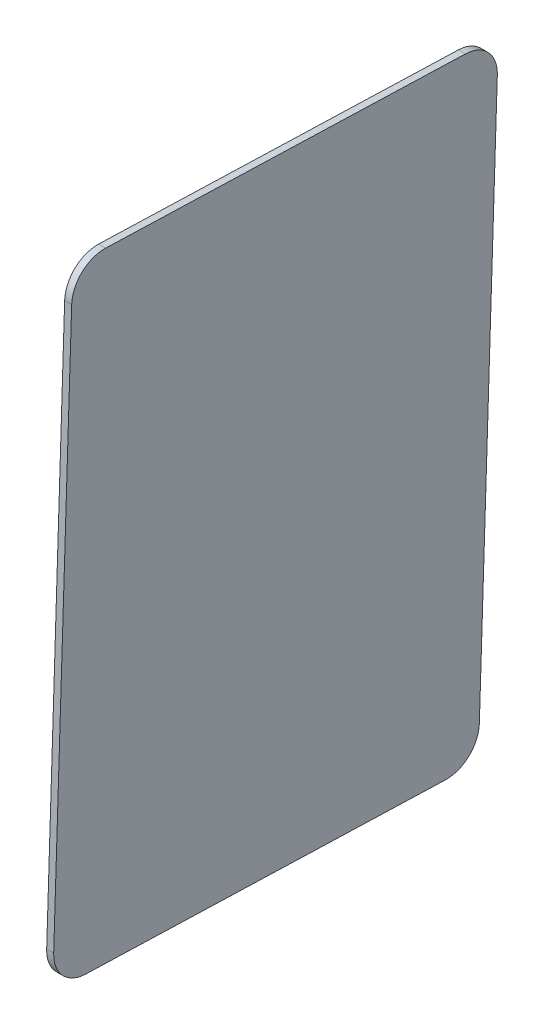
ISO-10303-21;
HEADER;
FILE_DESCRIPTION(('STEP AP214'),'2;1');
FILE_NAME('part.step','',(''),(''),'','','');
FILE_SCHEMA(('AUTOMOTIVE_DESIGN { 1 0 10303 214 1 1 1 1 }'));
ENDSEC;
DATA;
#1=APPLICATION_CONTEXT('core data for automotive mechanical design processes');
#2=APPLICATION_PROTOCOL_DEFINITION('international standard','automotive_design',2000,#1);
#3=PRODUCT_CONTEXT('',#1,'mechanical');
#4=PRODUCT('Part','Part','',(#3));
#5=PRODUCT_RELATED_PRODUCT_CATEGORY('part','',(#4));
#6=PRODUCT_DEFINITION_FORMATION('','',#4);
#7=PRODUCT_DEFINITION_CONTEXT('part definition',#1,'design');
#8=PRODUCT_DEFINITION('design','',#6,#7);
#9=PRODUCT_DEFINITION_SHAPE('','',#8);
#10=(LENGTH_UNIT() NAMED_UNIT(*) SI_UNIT(.MILLI.,.METRE.));
#11=(NAMED_UNIT(*) PLANE_ANGLE_UNIT() SI_UNIT($,.RADIAN.));
#12=(NAMED_UNIT(*) SI_UNIT($,.STERADIAN.) SOLID_ANGLE_UNIT());
#13=UNCERTAINTY_MEASURE_WITH_UNIT(LENGTH_MEASURE(1.E-05),#10,'distance_accuracy_value','');
#14=(GEOMETRIC_REPRESENTATION_CONTEXT(3) GLOBAL_UNCERTAINTY_ASSIGNED_CONTEXT((#13)) GLOBAL_UNIT_ASSIGNED_CONTEXT((#10,
#11,#12)) REPRESENTATION_CONTEXT('',''));
#15=CARTESIAN_POINT('',(0.,0.,0.));
#16=DIRECTION('',(0.,0.,1.));
#17=DIRECTION('',(1.,0.,0.));
#18=AXIS2_PLACEMENT_3D('',#15,#16,#17);
#19=CARTESIAN_POINT('',(-1.5875,93.6404901719661,16.3075723620404));
#20=DIRECTION('',(1.,0.,0.));
#21=DIRECTION('',(0.,0.,-1.));
#22=AXIS2_PLACEMENT_3D('',#19,#20,#21);
#23=CYLINDRICAL_SURFACE('',#22,7.45300000000001);
#24=CARTESIAN_POINT('',(0.,93.6404901719661,16.3075723620404));
#25=DIRECTION('',(1.,0.,0.));
#26=DIRECTION('',(0.,0.,-1.));
#27=AXIS2_PLACEMENT_3D('',#24,#25,#26);
#28=CIRCLE('',#27,7.45300000000001);
#29=CARTESIAN_POINT('',(0.,86.1914285600398,16.5498327626973));
#30=VERTEX_POINT('',#29);
#31=CARTESIAN_POINT('',(0.,93.3982297713091,8.85851075011408));
#32=VERTEX_POINT('',#31);
#33=EDGE_CURVE('E132',#30,#32,#28,.T.);
#34=ORIENTED_EDGE('',*,*,#33,.F.);
#35=DIRECTION('',(1.,0.,0.));
#36=VECTOR('',#35,1.);
#37=CARTESIAN_POINT('',(-1.5875,86.1914285600398,16.5498327626973));
#38=LINE('',#37,#36);
#39=CARTESIAN_POINT('',(-1.5875,86.1914285600398,16.5498327626973));
#40=VERTEX_POINT('',#39);
#41=EDGE_CURVE('E11',#40,#30,#38,.T.);
#42=ORIENTED_EDGE('',*,*,#41,.F.);
#43=CARTESIAN_POINT('',(-1.5875,93.6404901719661,16.3075723620404));
#44=DIRECTION('',(1.,0.,0.));
#45=DIRECTION('',(0.,0.,-1.));
#46=AXIS2_PLACEMENT_3D('',#43,#44,#45);
#47=CIRCLE('',#46,7.45300000000001);
#48=CARTESIAN_POINT('',(-1.5875,93.3982297713091,8.85851075011408));
#49=VERTEX_POINT('',#48);
#50=EDGE_CURVE('E152',#40,#49,#47,.T.);
#51=ORIENTED_EDGE('',*,*,#50,.T.);
#52=DIRECTION('',(1.,0.,0.));
#53=VECTOR('',#52,1.);
#54=CARTESIAN_POINT('',(-1.5875,93.3982297713091,8.85851075011408));
#55=LINE('',#54,#53);
#56=EDGE_CURVE('E38',#49,#32,#55,.T.);
#57=ORIENTED_EDGE('',*,*,#56,.T.);
#58=EDGE_LOOP('',(#34,#42,#51,#57));
#59=FACE_BOUND('',#58,.T.);
#60=ADVANCED_FACE('F35',(#59),#23,.T.);
#61=CARTESIAN_POINT('',(-1.5875,88.8375700381402,97.9138148695109));
#62=DIRECTION('',(0.,-0.999471570096104,0.0325050852887394));
#63=DIRECTION('',(0.,-0.0325050852887394,-0.999471570096104));
#64=AXIS2_PLACEMENT_3D('',#61,#62,#63);
#65=PLANE('',#64);
#66=DIRECTION('',(0.,-0.0325050852887394,-0.999471570096104));
#67=VECTOR('',#66,1.);
#68=CARTESIAN_POINT('',(0.,88.8375700381402,97.9138148695109));
#69=LINE('',#68,#67);
#70=CARTESIAN_POINT('',(0.,88.8375700381402,97.9138148695109));
#71=VERTEX_POINT('',#70);
#72=EDGE_CURVE('E150',#71,#30,#69,.T.);
#73=ORIENTED_EDGE('',*,*,#72,.F.);
#74=DIRECTION('',(1.,0.,0.));
#75=VECTOR('',#74,1.);
#76=CARTESIAN_POINT('',(-1.5875,88.8375700381402,97.9138148695109));
#77=LINE('',#76,#75);
#78=CARTESIAN_POINT('',(-1.5875,88.8375700381402,97.9138148695109));
#79=VERTEX_POINT('',#78);
#80=EDGE_CURVE('E44',#79,#71,#77,.T.);
#81=ORIENTED_EDGE('',*,*,#80,.F.);
#82=DIRECTION('',(0.,-0.0325050852887394,-0.999471570096104));
#83=VECTOR('',#82,1.);
#84=CARTESIAN_POINT('',(-1.5875,88.8375700381402,97.9138148695109));
#85=LINE('',#84,#83);
#86=EDGE_CURVE('E122',#79,#40,#85,.T.);
#87=ORIENTED_EDGE('',*,*,#86,.T.);
#88=ORIENTED_EDGE('',*,*,#41,.T.);
#89=EDGE_LOOP('',(#73,#81,#87,#88));
#90=FACE_BOUND('',#89,.T.);
#91=ADVANCED_FACE('F164',(#90),#65,.T.);
#92=CARTESIAN_POINT('',(-1.5875,96.2866316500665,97.6715544688539));
#93=DIRECTION('',(1.,0.,0.));
#94=DIRECTION('',(0.,0.,-1.));
#95=AXIS2_PLACEMENT_3D('',#92,#93,#94);
#96=CYLINDRICAL_SURFACE('',#95,7.453);
#97=CARTESIAN_POINT('',(0.,96.2866316500665,97.6715544688539));
#98=DIRECTION('',(1.,0.,0.));
#99=DIRECTION('',(0.,0.,-1.));
#100=AXIS2_PLACEMENT_3D('',#97,#98,#99);
#101=CIRCLE('',#100,7.453);
#102=CARTESIAN_POINT('',(0.,96.5288920507234,105.12061608078));
#103=VERTEX_POINT('',#102);
#104=EDGE_CURVE('E109',#103,#71,#101,.T.);
#105=ORIENTED_EDGE('',*,*,#104,.F.);
#106=DIRECTION('',(1.,0.,0.));
#107=VECTOR('',#106,1.);
#108=CARTESIAN_POINT('',(-1.5875,96.5288920507234,105.12061608078));
#109=LINE('',#108,#107);
#110=CARTESIAN_POINT('',(-1.5875,96.5288920507234,105.12061608078));
#111=VERTEX_POINT('',#110);
#112=EDGE_CURVE('E104',#111,#103,#109,.T.);
#113=ORIENTED_EDGE('',*,*,#112,.F.);
#114=CARTESIAN_POINT('',(-1.5875,96.2866316500665,97.6715544688539));
#115=DIRECTION('',(1.,0.,0.));
#116=DIRECTION('',(0.,0.,-1.));
#117=AXIS2_PLACEMENT_3D('',#114,#115,#116);
#118=CIRCLE('',#117,7.453);
#119=EDGE_CURVE('E107',#111,#79,#118,.T.);
#120=ORIENTED_EDGE('',*,*,#119,.T.);
#121=ORIENTED_EDGE('',*,*,#80,.T.);
#122=EDGE_LOOP('',(#105,#113,#120,#121));
#123=FACE_BOUND('',#122,.T.);
#124=ADVANCED_FACE('F106',(#123),#96,.T.);
#125=CARTESIAN_POINT('',(-1.5875,221.557788111896,101.054392436585));
#126=DIRECTION('',(0.,0.0325050852887394,0.999471570096104));
#127=DIRECTION('',(0.,-0.999471570096104,0.0325050852887394));
#128=AXIS2_PLACEMENT_3D('',#125,#126,#127);
#129=PLANE('',#128);
#130=DIRECTION('',(0.,-0.999471570096104,0.0325050852887394));
#131=VECTOR('',#130,1.);
#132=CARTESIAN_POINT('',(0.,221.557788111896,101.054392436585));
#133=LINE('',#132,#131);
#134=CARTESIAN_POINT('',(0.,221.557788111896,101.054392436585));
#135=VERTEX_POINT('',#134);
#136=EDGE_CURVE('E147',#135,#103,#133,.T.);
#137=ORIENTED_EDGE('',*,*,#136,.F.);
#138=DIRECTION('',(1.,0.,0.));
#139=VECTOR('',#138,1.);
#140=CARTESIAN_POINT('',(-1.5875,221.557788111896,101.054392436585));
#141=LINE('',#140,#139);
#142=CARTESIAN_POINT('',(-1.5875,221.557788111896,101.054392436585));
#143=VERTEX_POINT('',#142);
#144=EDGE_CURVE('E114',#143,#135,#141,.T.);
#145=ORIENTED_EDGE('',*,*,#144,.F.);
#146=DIRECTION('',(0.,-0.999471570096104,0.0325050852887394));
#147=VECTOR('',#146,1.);
#148=CARTESIAN_POINT('',(-1.5875,221.557788111896,101.054392436585));
#149=LINE('',#148,#147);
#150=EDGE_CURVE('E120',#143,#111,#149,.T.);
#151=ORIENTED_EDGE('',*,*,#150,.T.);
#152=ORIENTED_EDGE('',*,*,#112,.T.);
#153=EDGE_LOOP('',(#137,#145,#151,#152));
#154=FACE_BOUND('',#153,.T.);
#155=ADVANCED_FACE('F124',(#154),#129,.T.);
#156=CARTESIAN_POINT('',(-1.5875,221.315527711239,93.605330824659));
#157=DIRECTION('',(1.,0.,0.));
#158=DIRECTION('',(0.,0.,-1.));
#159=AXIS2_PLACEMENT_3D('',#156,#157,#158);
#160=CYLINDRICAL_SURFACE('',#159,7.453);
#161=CARTESIAN_POINT('',(0.,221.315527711239,93.605330824659));
#162=DIRECTION('',(1.,0.,0.));
#163=DIRECTION('',(0.,0.,-1.));
#164=AXIS2_PLACEMENT_3D('',#161,#162,#163);
#165=CIRCLE('',#164,7.453);
#166=CARTESIAN_POINT('',(0.,228.764589323165,93.3630704240021));
#167=VERTEX_POINT('',#166);
#168=EDGE_CURVE('E144',#167,#135,#165,.T.);
#169=ORIENTED_EDGE('',*,*,#168,.F.);
#170=DIRECTION('',(1.,0.,0.));
#171=VECTOR('',#170,1.);
#172=CARTESIAN_POINT('',(-1.5875,228.764589323165,93.3630704240021));
#173=LINE('',#172,#171);
#174=CARTESIAN_POINT('',(-1.5875,228.764589323165,93.3630704240021));
#175=VERTEX_POINT('',#174);
#176=EDGE_CURVE('E156',#175,#167,#173,.T.);
#177=ORIENTED_EDGE('',*,*,#176,.F.);
#178=CARTESIAN_POINT('',(-1.5875,221.315527711239,93.605330824659));
#179=DIRECTION('',(1.,0.,0.));
#180=DIRECTION('',(0.,0.,-1.));
#181=AXIS2_PLACEMENT_3D('',#178,#179,#180);
#182=CIRCLE('',#181,7.453);
#183=EDGE_CURVE('E125',#175,#143,#182,.T.);
#184=ORIENTED_EDGE('',*,*,#183,.T.);
#185=ORIENTED_EDGE('',*,*,#144,.T.);
#186=EDGE_LOOP('',(#169,#177,#184,#185));
#187=FACE_BOUND('',#186,.T.);
#188=ADVANCED_FACE('F177',(#187),#160,.T.);
#189=CARTESIAN_POINT('',(-1.5875,226.118447845064,11.9990883171885));
#190=DIRECTION('',(0.,0.999471570096104,-0.0325050852887394));
#191=DIRECTION('',(0.,0.0325050852887394,0.999471570096104));
#192=AXIS2_PLACEMENT_3D('',#189,#190,#191);
#193=PLANE('',#192);
#194=DIRECTION('',(0.,0.0325050852887394,0.999471570096104));
#195=VECTOR('',#194,1.);
#196=CARTESIAN_POINT('',(0.,226.118447845064,11.9990883171885));
#197=LINE('',#196,#195);
#198=CARTESIAN_POINT('',(0.,226.118447845064,11.9990883171885));
#199=VERTEX_POINT('',#198);
#200=EDGE_CURVE('E141',#199,#167,#197,.T.);
#201=ORIENTED_EDGE('',*,*,#200,.F.);
#202=DIRECTION('',(1.,0.,0.));
#203=VECTOR('',#202,1.);
#204=CARTESIAN_POINT('',(-1.5875,226.118447845064,11.9990883171885));
#205=LINE('',#204,#203);
#206=CARTESIAN_POINT('',(-1.5875,226.118447845064,11.9990883171885));
#207=VERTEX_POINT('',#206);
#208=EDGE_CURVE('E158',#207,#199,#205,.T.);
#209=ORIENTED_EDGE('',*,*,#208,.F.);
#210=DIRECTION('',(0.,0.0325050852887394,0.999471570096104));
#211=VECTOR('',#210,1.);
#212=CARTESIAN_POINT('',(-1.5875,226.118447845064,11.9990883171885));
#213=LINE('',#212,#211);
#214=EDGE_CURVE('E127',#207,#175,#213,.T.);
#215=ORIENTED_EDGE('',*,*,#214,.T.);
#216=ORIENTED_EDGE('',*,*,#176,.T.);
#217=EDGE_LOOP('',(#201,#209,#215,#216));
#218=FACE_BOUND('',#217,.T.);
#219=ADVANCED_FACE('F180',(#218),#193,.T.);
#220=CARTESIAN_POINT('',(-1.5875,218.669386233138,12.2413487178455));
#221=DIRECTION('',(1.,0.,0.));
#222=DIRECTION('',(0.,0.,-1.));
#223=AXIS2_PLACEMENT_3D('',#220,#221,#222);
#224=CYLINDRICAL_SURFACE('',#223,7.45300000000001);
#225=CARTESIAN_POINT('',(0.,218.669386233138,12.2413487178455));
#226=DIRECTION('',(1.,0.,0.));
#227=DIRECTION('',(0.,0.,-1.));
#228=AXIS2_PLACEMENT_3D('',#225,#226,#227);
#229=CIRCLE('',#228,7.45300000000001);
#230=CARTESIAN_POINT('',(0.,218.427125832481,4.79228710591921));
#231=VERTEX_POINT('',#230);
#232=EDGE_CURVE('E138',#231,#199,#229,.T.);
#233=ORIENTED_EDGE('',*,*,#232,.F.);
#234=DIRECTION('',(1.,0.,0.));
#235=VECTOR('',#234,1.);
#236=CARTESIAN_POINT('',(-1.5875,218.427125832481,4.79228710591921));
#237=LINE('',#236,#235);
#238=CARTESIAN_POINT('',(-1.5875,218.427125832481,4.79228710591921));
#239=VERTEX_POINT('',#238);
#240=EDGE_CURVE('E159',#239,#231,#237,.T.);
#241=ORIENTED_EDGE('',*,*,#240,.F.);
#242=CARTESIAN_POINT('',(-1.5875,218.669386233138,12.2413487178455));
#243=DIRECTION('',(1.,0.,0.));
#244=DIRECTION('',(0.,0.,-1.));
#245=AXIS2_PLACEMENT_3D('',#242,#243,#244);
#246=CIRCLE('',#245,7.45300000000001);
#247=EDGE_CURVE('E255',#239,#207,#246,.T.);
#248=ORIENTED_EDGE('',*,*,#247,.T.);
#249=ORIENTED_EDGE('',*,*,#208,.T.);
#250=EDGE_LOOP('',(#233,#241,#248,#249));
#251=FACE_BOUND('',#250,.T.);
#252=ADVANCED_FACE('F184',(#251),#224,.T.);
#253=CARTESIAN_POINT('',(-1.5875,93.3982297713091,8.85851075011408));
#254=DIRECTION('',(0.,-0.0325050852887395,-0.999471570096104));
#255=DIRECTION('',(0.,0.999471570096104,-0.0325050852887395));
#256=AXIS2_PLACEMENT_3D('',#253,#254,#255);
#257=PLANE('',#256);
#258=DIRECTION('',(0.,0.999471570096104,-0.0325050852887395));
#259=VECTOR('',#258,1.);
#260=CARTESIAN_POINT('',(0.,93.3982297713091,8.85851075011408));
#261=LINE('',#260,#259);
#262=EDGE_CURVE('E135',#32,#231,#261,.T.);
#263=ORIENTED_EDGE('',*,*,#262,.F.);
#264=ORIENTED_EDGE('',*,*,#56,.F.);
#265=DIRECTION('',(0.,0.999471570096104,-0.0325050852887395));
#266=VECTOR('',#265,1.);
#267=CARTESIAN_POINT('',(-1.5875,93.3982297713091,8.85851075011408));
#268=LINE('',#267,#266);
#269=EDGE_CURVE('E256',#49,#239,#268,.T.);
#270=ORIENTED_EDGE('',*,*,#269,.T.);
#271=ORIENTED_EDGE('',*,*,#240,.T.);
#272=EDGE_LOOP('',(#263,#264,#270,#271));
#273=FACE_BOUND('',#272,.T.);
#274=ADVANCED_FACE('F161',(#273),#257,.T.);
#275=CARTESIAN_POINT('',(-1.5875,93.6404901719661,16.3075723620404));
#276=DIRECTION('',(1.,0.,0.));
#277=DIRECTION('',(0.,0.,-1.));
#278=AXIS2_PLACEMENT_3D('',#275,#276,#277);
#279=PLANE('',#278);
#280=ORIENTED_EDGE('',*,*,#50,.F.);
#281=ORIENTED_EDGE('',*,*,#86,.F.);
#282=ORIENTED_EDGE('',*,*,#119,.F.);
#283=ORIENTED_EDGE('',*,*,#150,.F.);
#284=ORIENTED_EDGE('',*,*,#183,.F.);
#285=ORIENTED_EDGE('',*,*,#214,.F.);
#286=ORIENTED_EDGE('',*,*,#247,.F.);
#287=ORIENTED_EDGE('',*,*,#269,.F.);
#288=EDGE_LOOP('',(#280,#281,#282,#283,#284,#285,#286,#287));
#289=FACE_BOUND('',#288,.T.);
#290=ADVANCED_FACE('F118',(#289),#279,.F.);
#291=CARTESIAN_POINT('',(0.,93.6404901719661,16.3075723620404));
#292=DIRECTION('',(1.,0.,0.));
#293=DIRECTION('',(0.,0.,-1.));
#294=AXIS2_PLACEMENT_3D('',#291,#292,#293);
#295=PLANE('',#294);
#296=ORIENTED_EDGE('',*,*,#33,.T.);
#297=ORIENTED_EDGE('',*,*,#262,.T.);
#298=ORIENTED_EDGE('',*,*,#232,.T.);
#299=ORIENTED_EDGE('',*,*,#200,.T.);
#300=ORIENTED_EDGE('',*,*,#168,.T.);
#301=ORIENTED_EDGE('',*,*,#136,.T.);
#302=ORIENTED_EDGE('',*,*,#104,.T.);
#303=ORIENTED_EDGE('',*,*,#72,.T.);
#304=EDGE_LOOP('',(#296,#297,#298,#299,#300,#301,#302,#303));
#305=FACE_BOUND('',#304,.T.);
#306=ADVANCED_FACE('F163',(#305),#295,.T.);
#307=CLOSED_SHELL('',(#60,#91,#124,#155,#188,#219,#252,#274,#290,#306));
#308=MANIFOLD_SOLID_BREP('B2',#307);
#309=ADVANCED_BREP_SHAPE_REPRESENTATION('',(#18,#308),#14);
#310=SHAPE_DEFINITION_REPRESENTATION(#9,#309);
ENDSEC;
END-ISO-10303-21;
